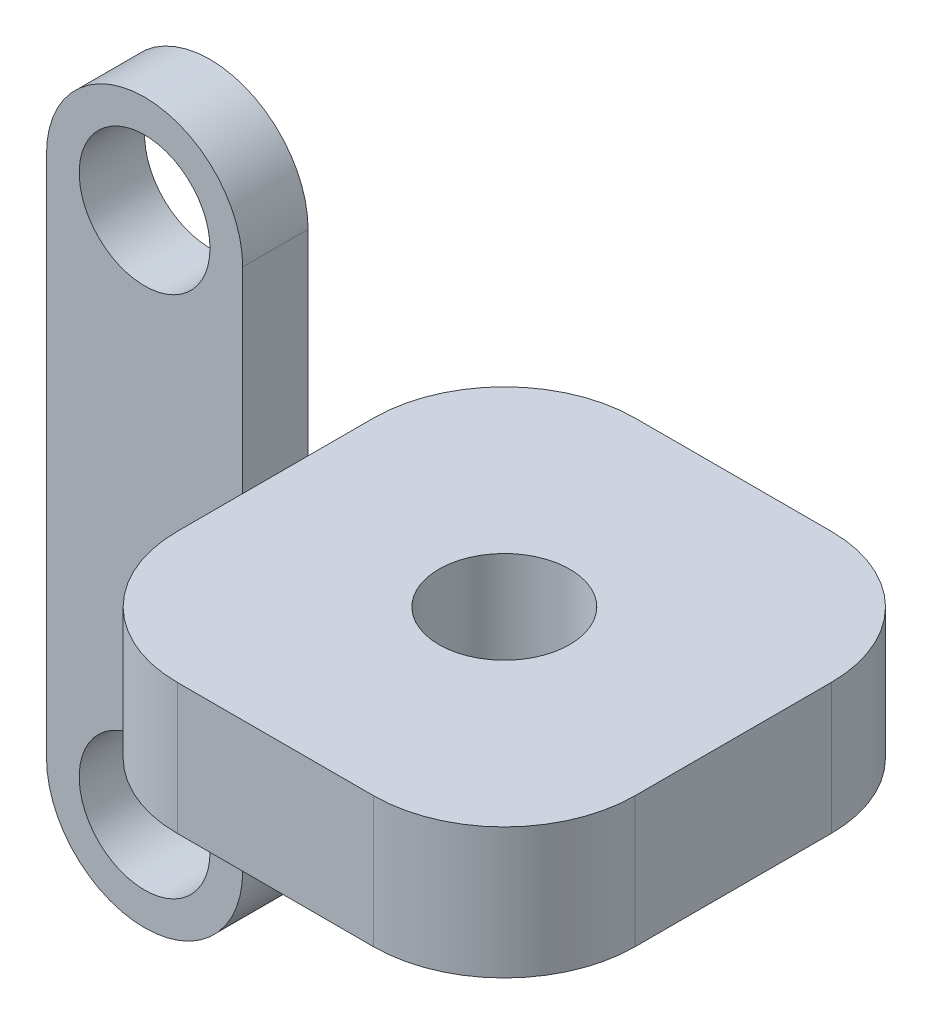
ISO-10303-21;
HEADER;
FILE_DESCRIPTION(('STEP AP214'),'2;1');
FILE_NAME('part.step','',(''),(''),'','','');
FILE_SCHEMA(('AUTOMOTIVE_DESIGN { 1 0 10303 214 1 1 1 1 }'));
ENDSEC;
DATA;
#1=APPLICATION_CONTEXT('core data for automotive mechanical design processes');
#2=APPLICATION_PROTOCOL_DEFINITION('international standard','automotive_design',2000,#1);
#3=PRODUCT_CONTEXT('',#1,'mechanical');
#4=PRODUCT('Part','Part','',(#3));
#5=PRODUCT_RELATED_PRODUCT_CATEGORY('part','',(#4));
#6=PRODUCT_DEFINITION_FORMATION('','',#4);
#7=PRODUCT_DEFINITION_CONTEXT('part definition',#1,'design');
#8=PRODUCT_DEFINITION('design','',#6,#7);
#9=PRODUCT_DEFINITION_SHAPE('','',#8);
#10=(LENGTH_UNIT() NAMED_UNIT(*) SI_UNIT(.MILLI.,.METRE.));
#11=(NAMED_UNIT(*) PLANE_ANGLE_UNIT() SI_UNIT($,.RADIAN.));
#12=(NAMED_UNIT(*) SI_UNIT($,.STERADIAN.) SOLID_ANGLE_UNIT());
#13=UNCERTAINTY_MEASURE_WITH_UNIT(LENGTH_MEASURE(1.E-05),#10,'distance_accuracy_value','');
#14=(GEOMETRIC_REPRESENTATION_CONTEXT(3) GLOBAL_UNCERTAINTY_ASSIGNED_CONTEXT((#13)) GLOBAL_UNIT_ASSIGNED_CONTEXT((#10,
#11,#12)) REPRESENTATION_CONTEXT('',''));
#15=CARTESIAN_POINT('',(0.,0.,0.));
#16=DIRECTION('',(0.,0.,1.));
#17=DIRECTION('',(1.,0.,0.));
#18=AXIS2_PLACEMENT_3D('',#15,#16,#17);
#19=CARTESIAN_POINT('',(0.,20.,5.));
#20=DIRECTION('',(-1.,0.,0.));
#21=DIRECTION('',(0.,-1.,0.));
#22=AXIS2_PLACEMENT_3D('',#19,#20,#21);
#23=PLANE('',#22);
#24=DIRECTION('',(0.,0.,1.));
#25=VECTOR('',#24,1.);
#26=CARTESIAN_POINT('',(0.,-5.,-15.));
#27=LINE('',#26,#25);
#28=CARTESIAN_POINT('',(0.,-5.,0.));
#29=VERTEX_POINT('',#28);
#30=CARTESIAN_POINT('',(0.,-5.,5.));
#31=VERTEX_POINT('',#30);
#32=EDGE_CURVE('E270',#29,#31,#27,.T.);
#33=ORIENTED_EDGE('',*,*,#32,.T.);
#34=DIRECTION('',(0.,1.,0.));
#35=VECTOR('',#34,1.);
#36=CARTESIAN_POINT('',(0.,20.,5.));
#37=LINE('',#36,#35);
#38=CARTESIAN_POINT('',(0.,-20.,5.));
#39=VERTEX_POINT('',#38);
#40=EDGE_CURVE('E193',#39,#31,#37,.T.);
#41=ORIENTED_EDGE('',*,*,#40,.F.);
#42=DIRECTION('',(0.,0.,-1.));
#43=VECTOR('',#42,1.);
#44=CARTESIAN_POINT('',(0.,-20.,5.));
#45=LINE('',#44,#43);
#46=CARTESIAN_POINT('',(0.,-20.,0.));
#47=VERTEX_POINT('',#46);
#48=EDGE_CURVE('E192',#39,#47,#45,.T.);
#49=ORIENTED_EDGE('',*,*,#48,.T.);
#50=DIRECTION('',(0.,1.,0.));
#51=VECTOR('',#50,1.);
#52=CARTESIAN_POINT('',(0.,20.,0.));
#53=LINE('',#52,#51);
#54=EDGE_CURVE('E175',#47,#29,#53,.T.);
#55=ORIENTED_EDGE('',*,*,#54,.T.);
#56=EDGE_LOOP('',(#33,#41,#49,#55));
#57=FACE_BOUND('',#56,.T.);
#58=ADVANCED_FACE('F39',(#57),#23,.F.);
#59=CARTESIAN_POINT('',(-7.49999999999999,20.,5.));
#60=DIRECTION('',(0.,0.,-1.));
#61=DIRECTION('',(-1.,0.,0.));
#62=AXIS2_PLACEMENT_3D('',#59,#60,#61);
#63=CYLINDRICAL_SURFACE('',#62,7.5);
#64=CARTESIAN_POINT('',(-7.49999999999999,20.,0.));
#65=DIRECTION('',(0.,0.,1.));
#66=DIRECTION('',(1.,0.,0.));
#67=AXIS2_PLACEMENT_3D('',#64,#65,#66);
#68=CIRCLE('',#67,7.5);
#69=CARTESIAN_POINT('',(0.,20.,0.));
#70=VERTEX_POINT('',#69);
#71=CARTESIAN_POINT('',(-15.,20.,0.));
#72=VERTEX_POINT('',#71);
#73=EDGE_CURVE('E168',#70,#72,#68,.T.);
#74=ORIENTED_EDGE('',*,*,#73,.T.);
#75=DIRECTION('',(0.,0.,-1.));
#76=VECTOR('',#75,1.);
#77=CARTESIAN_POINT('',(-15.,20.,5.));
#78=LINE('',#77,#76);
#79=CARTESIAN_POINT('',(-15.,20.,5.));
#80=VERTEX_POINT('',#79);
#81=EDGE_CURVE('E201',#80,#72,#78,.T.);
#82=ORIENTED_EDGE('',*,*,#81,.F.);
#83=CARTESIAN_POINT('',(-7.49999999999999,20.,5.));
#84=DIRECTION('',(0.,0.,1.));
#85=DIRECTION('',(1.,0.,0.));
#86=AXIS2_PLACEMENT_3D('',#83,#84,#85);
#87=CIRCLE('',#86,7.5);
#88=CARTESIAN_POINT('',(0.,20.,5.));
#89=VERTEX_POINT('',#88);
#90=EDGE_CURVE('E185',#89,#80,#87,.T.);
#91=ORIENTED_EDGE('',*,*,#90,.F.);
#92=DIRECTION('',(0.,0.,-1.));
#93=VECTOR('',#92,1.);
#94=CARTESIAN_POINT('',(0.,20.,5.));
#95=LINE('',#94,#93);
#96=EDGE_CURVE('E189',#89,#70,#95,.T.);
#97=ORIENTED_EDGE('',*,*,#96,.T.);
#98=EDGE_LOOP('',(#74,#82,#91,#97));
#99=FACE_BOUND('',#98,.T.);
#100=ADVANCED_FACE('F372',(#99),#63,.T.);
#101=CARTESIAN_POINT('',(-15.,20.,5.));
#102=DIRECTION('',(1.,0.,0.));
#103=DIRECTION('',(0.,1.,0.));
#104=AXIS2_PLACEMENT_3D('',#101,#102,#103);
#105=PLANE('',#104);
#106=DIRECTION('',(0.,-1.,0.));
#107=VECTOR('',#106,1.);
#108=CARTESIAN_POINT('',(-15.,20.,0.));
#109=LINE('',#108,#107);
#110=CARTESIAN_POINT('',(-15.,-20.,0.));
#111=VERTEX_POINT('',#110);
#112=EDGE_CURVE('E311',#72,#111,#109,.T.);
#113=ORIENTED_EDGE('',*,*,#112,.T.);
#114=DIRECTION('',(0.,0.,-1.));
#115=VECTOR('',#114,1.);
#116=CARTESIAN_POINT('',(-15.,-20.,5.));
#117=LINE('',#116,#115);
#118=CARTESIAN_POINT('',(-15.,-20.,5.));
#119=VERTEX_POINT('',#118);
#120=EDGE_CURVE('E197',#119,#111,#117,.T.);
#121=ORIENTED_EDGE('',*,*,#120,.F.);
#122=DIRECTION('',(0.,-1.,0.));
#123=VECTOR('',#122,1.);
#124=CARTESIAN_POINT('',(-15.,20.,5.));
#125=LINE('',#124,#123);
#126=EDGE_CURVE('E301',#80,#119,#125,.T.);
#127=ORIENTED_EDGE('',*,*,#126,.F.);
#128=ORIENTED_EDGE('',*,*,#81,.T.);
#129=EDGE_LOOP('',(#113,#121,#127,#128));
#130=FACE_BOUND('',#129,.T.);
#131=ADVANCED_FACE('F377',(#130),#105,.F.);
#132=CARTESIAN_POINT('',(-7.49999999999999,-20.,5.));
#133=DIRECTION('',(0.,0.,-1.));
#134=DIRECTION('',(-1.,0.,0.));
#135=AXIS2_PLACEMENT_3D('',#132,#133,#134);
#136=CYLINDRICAL_SURFACE('',#135,7.5);
#137=CARTESIAN_POINT('',(-7.49999999999999,-20.,0.));
#138=DIRECTION('',(0.,0.,1.));
#139=DIRECTION('',(1.,0.,0.));
#140=AXIS2_PLACEMENT_3D('',#137,#138,#139);
#141=CIRCLE('',#140,7.5);
#142=EDGE_CURVE('E173',#111,#47,#141,.T.);
#143=ORIENTED_EDGE('',*,*,#142,.T.);
#144=ORIENTED_EDGE('',*,*,#48,.F.);
#145=CARTESIAN_POINT('',(-7.49999999999999,-20.,5.));
#146=DIRECTION('',(0.,0.,1.));
#147=DIRECTION('',(1.,0.,0.));
#148=AXIS2_PLACEMENT_3D('',#145,#146,#147);
#149=CIRCLE('',#148,7.5);
#150=EDGE_CURVE('E304',#119,#39,#149,.T.);
#151=ORIENTED_EDGE('',*,*,#150,.F.);
#152=ORIENTED_EDGE('',*,*,#120,.T.);
#153=EDGE_LOOP('',(#143,#144,#151,#152));
#154=FACE_BOUND('',#153,.T.);
#155=ADVANCED_FACE('F319',(#154),#136,.T.);
#156=CARTESIAN_POINT('',(0.,5.,5.));
#157=VERTEX_POINT('',#156);
#158=EDGE_CURVE('E177',#157,#89,#37,.T.);
#159=ORIENTED_EDGE('',*,*,#158,.F.);
#160=DIRECTION('',(0.,0.,1.));
#161=VECTOR('',#160,1.);
#162=CARTESIAN_POINT('',(0.,5.,-15.));
#163=LINE('',#162,#161);
#164=CARTESIAN_POINT('',(0.,5.,0.));
#165=VERTEX_POINT('',#164);
#166=EDGE_CURVE('E148',#165,#157,#163,.T.);
#167=ORIENTED_EDGE('',*,*,#166,.F.);
#168=EDGE_CURVE('E162',#165,#70,#53,.T.);
#169=ORIENTED_EDGE('',*,*,#168,.T.);
#170=ORIENTED_EDGE('',*,*,#96,.F.);
#171=EDGE_LOOP('',(#159,#167,#169,#170));
#172=FACE_BOUND('',#171,.T.);
#173=ADVANCED_FACE('F176',(#172),#23,.F.);
#174=CARTESIAN_POINT('',(-7.49999999999999,20.,5.));
#175=DIRECTION('',(0.,0.,1.));
#176=DIRECTION('',(1.,0.,0.));
#177=AXIS2_PLACEMENT_3D('',#174,#175,#176);
#178=PLANE('',#177);
#179=CARTESIAN_POINT('',(-7.49999999999999,20.,5.));
#180=DIRECTION('',(0.,0.,1.));
#181=DIRECTION('',(1.,0.,0.));
#182=AXIS2_PLACEMENT_3D('',#179,#180,#181);
#183=CIRCLE('',#182,5.);
#184=CARTESIAN_POINT('',(-2.49999999999999,20.,5.));
#185=VERTEX_POINT('',#184);
#186=EDGE_CURVE('E287',#185,#185,#183,.T.);
#187=ORIENTED_EDGE('',*,*,#186,.F.);
#188=EDGE_LOOP('',(#187));
#189=FACE_BOUND('',#188,.T.);
#190=CARTESIAN_POINT('',(-7.49999999999999,-20.,5.));
#191=DIRECTION('',(0.,0.,1.));
#192=DIRECTION('',(1.,0.,0.));
#193=AXIS2_PLACEMENT_3D('',#190,#191,#192);
#194=CIRCLE('',#193,5.);
#195=CARTESIAN_POINT('',(-2.49999999999999,-20.,5.));
#196=VERTEX_POINT('',#195);
#197=EDGE_CURVE('E281',#196,#196,#194,.T.);
#198=ORIENTED_EDGE('',*,*,#197,.F.);
#199=EDGE_LOOP('',(#198));
#200=FACE_BOUND('',#199,.T.);
#201=ORIENTED_EDGE('',*,*,#90,.T.);
#202=ORIENTED_EDGE('',*,*,#126,.T.);
#203=ORIENTED_EDGE('',*,*,#150,.T.);
#204=ORIENTED_EDGE('',*,*,#40,.T.);
#205=DIRECTION('',(0.,1.,0.));
#206=VECTOR('',#205,1.);
#207=CARTESIAN_POINT('',(0.,20.,5.));
#208=LINE('',#207,#206);
#209=EDGE_CURVE('E278',#31,#157,#208,.T.);
#210=ORIENTED_EDGE('',*,*,#209,.T.);
#211=ORIENTED_EDGE('',*,*,#158,.T.);
#212=EDGE_LOOP('',(#201,#202,#203,#204,#210,#211));
#213=FACE_BOUND('',#212,.T.);
#214=ADVANCED_FACE('F326',(#189,#200,#213),#178,.T.);
#215=CARTESIAN_POINT('',(-7.49999999999999,20.,0.));
#216=DIRECTION('',(0.,0.,1.));
#217=DIRECTION('',(1.,0.,0.));
#218=AXIS2_PLACEMENT_3D('',#215,#216,#217);
#219=PLANE('',#218);
#220=CARTESIAN_POINT('',(-7.49999999999999,20.,0.));
#221=DIRECTION('',(0.,0.,1.));
#222=DIRECTION('',(1.,0.,0.));
#223=AXIS2_PLACEMENT_3D('',#220,#221,#222);
#224=CIRCLE('',#223,5.);
#225=CARTESIAN_POINT('',(-2.49999999999999,20.,0.));
#226=VERTEX_POINT('',#225);
#227=EDGE_CURVE('E283',#226,#226,#224,.T.);
#228=ORIENTED_EDGE('',*,*,#227,.T.);
#229=EDGE_LOOP('',(#228));
#230=FACE_BOUND('',#229,.T.);
#231=CARTESIAN_POINT('',(-7.49999999999999,-20.,0.));
#232=DIRECTION('',(0.,0.,1.));
#233=DIRECTION('',(1.,0.,0.));
#234=AXIS2_PLACEMENT_3D('',#231,#232,#233);
#235=CIRCLE('',#234,5.);
#236=CARTESIAN_POINT('',(-2.49999999999999,-20.,0.));
#237=VERTEX_POINT('',#236);
#238=EDGE_CURVE('E291',#237,#237,#235,.T.);
#239=ORIENTED_EDGE('',*,*,#238,.T.);
#240=EDGE_LOOP('',(#239));
#241=FACE_BOUND('',#240,.T.);
#242=ORIENTED_EDGE('',*,*,#73,.F.);
#243=ORIENTED_EDGE('',*,*,#168,.F.);
#244=EDGE_CURVE('E165',#29,#165,#53,.T.);
#245=ORIENTED_EDGE('',*,*,#244,.F.);
#246=ORIENTED_EDGE('',*,*,#54,.F.);
#247=ORIENTED_EDGE('',*,*,#142,.F.);
#248=ORIENTED_EDGE('',*,*,#112,.F.);
#249=EDGE_LOOP('',(#242,#243,#245,#246,#247,#248));
#250=FACE_BOUND('',#249,.T.);
#251=ADVANCED_FACE('F163',(#230,#241,#250),#219,.F.);
#252=CARTESIAN_POINT('',(-7.49999999999999,-20.,0.));
#253=DIRECTION('',(0.,0.,1.));
#254=DIRECTION('',(1.,0.,0.));
#255=AXIS2_PLACEMENT_3D('',#252,#253,#254);
#256=CYLINDRICAL_SURFACE('',#255,5.);
#257=ORIENTED_EDGE('',*,*,#238,.F.);
#258=EDGE_LOOP('',(#257));
#259=FACE_BOUND('',#258,.T.);
#260=ORIENTED_EDGE('',*,*,#197,.T.);
#261=EDGE_LOOP('',(#260));
#262=FACE_BOUND('',#261,.T.);
#263=ADVANCED_FACE('F417',(#259,#262),#256,.F.);
#264=CARTESIAN_POINT('',(-7.49999999999999,20.,0.));
#265=DIRECTION('',(0.,0.,1.));
#266=DIRECTION('',(1.,0.,0.));
#267=AXIS2_PLACEMENT_3D('',#264,#265,#266);
#268=CYLINDRICAL_SURFACE('',#267,5.);
#269=ORIENTED_EDGE('',*,*,#227,.F.);
#270=EDGE_LOOP('',(#269));
#271=FACE_BOUND('',#270,.T.);
#272=ORIENTED_EDGE('',*,*,#186,.T.);
#273=EDGE_LOOP('',(#272));
#274=FACE_BOUND('',#273,.T.);
#275=ADVANCED_FACE('F414',(#271,#274),#268,.F.);
#276=CARTESIAN_POINT('',(0.,5.,-15.));
#277=DIRECTION('',(1.,0.,0.));
#278=DIRECTION('',(0.,0.,-1.));
#279=AXIS2_PLACEMENT_3D('',#276,#277,#278);
#280=PLANE('',#279);
#281=CARTESIAN_POINT('',(0.,5.,-5.));
#282=VERTEX_POINT('',#281);
#283=EDGE_CURVE('E142',#282,#165,#163,.T.);
#284=ORIENTED_EDGE('',*,*,#283,.F.);
#285=DIRECTION('',(0.,-1.,0.));
#286=VECTOR('',#285,1.);
#287=CARTESIAN_POINT('',(0.,5.,-5.));
#288=LINE('',#287,#286);
#289=CARTESIAN_POINT('',(0.,-5.,-5.));
#290=VERTEX_POINT('',#289);
#291=EDGE_CURVE('E205',#282,#290,#288,.T.);
#292=ORIENTED_EDGE('',*,*,#291,.T.);
#293=EDGE_CURVE('E182',#290,#29,#27,.T.);
#294=ORIENTED_EDGE('',*,*,#293,.T.);
#295=ORIENTED_EDGE('',*,*,#244,.T.);
#296=EDGE_LOOP('',(#284,#292,#294,#295));
#297=FACE_BOUND('',#296,.T.);
#298=ADVANCED_FACE('F180',(#297),#280,.F.);
#299=CARTESIAN_POINT('',(0.,-5.,10.));
#300=VERTEX_POINT('',#299);
#301=EDGE_CURVE('E272',#31,#300,#27,.T.);
#302=ORIENTED_EDGE('',*,*,#301,.T.);
#303=DIRECTION('',(0.,-1.,0.));
#304=VECTOR('',#303,1.);
#305=CARTESIAN_POINT('',(0.,5.,10.));
#306=LINE('',#305,#304);
#307=CARTESIAN_POINT('',(0.,5.,10.));
#308=VERTEX_POINT('',#307);
#309=EDGE_CURVE('E11',#300,#308,#306,.F.);
#310=ORIENTED_EDGE('',*,*,#309,.T.);
#311=EDGE_CURVE('E158',#157,#308,#163,.T.);
#312=ORIENTED_EDGE('',*,*,#311,.F.);
#313=ORIENTED_EDGE('',*,*,#209,.F.);
#314=EDGE_LOOP('',(#302,#310,#312,#313));
#315=FACE_BOUND('',#314,.T.);
#316=ADVANCED_FACE('F329',(#315),#280,.F.);
#317=CARTESIAN_POINT('',(0.,5.,20.));
#318=DIRECTION('',(0.,0.,-1.));
#319=DIRECTION('',(-1.,0.,0.));
#320=AXIS2_PLACEMENT_3D('',#317,#318,#319);
#321=PLANE('',#320);
#322=DIRECTION('',(1.,0.,0.));
#323=VECTOR('',#322,1.);
#324=CARTESIAN_POINT('',(0.,5.,20.));
#325=LINE('',#324,#323);
#326=CARTESIAN_POINT('',(10.,5.,20.));
#327=VERTEX_POINT('',#326);
#328=CARTESIAN_POINT('',(25.,5.,20.));
#329=VERTEX_POINT('',#328);
#330=EDGE_CURVE('E156',#327,#329,#325,.T.);
#331=ORIENTED_EDGE('',*,*,#330,.F.);
#332=DIRECTION('',(0.,-1.,0.));
#333=VECTOR('',#332,1.);
#334=CARTESIAN_POINT('',(10.,5.,20.));
#335=LINE('',#334,#333);
#336=CARTESIAN_POINT('',(10.,-5.,20.));
#337=VERTEX_POINT('',#336);
#338=EDGE_CURVE('E49',#327,#337,#335,.T.);
#339=ORIENTED_EDGE('',*,*,#338,.T.);
#340=DIRECTION('',(1.,0.,0.));
#341=VECTOR('',#340,1.);
#342=CARTESIAN_POINT('',(0.,-5.,20.));
#343=LINE('',#342,#341);
#344=CARTESIAN_POINT('',(25.,-5.,20.));
#345=VERTEX_POINT('',#344);
#346=EDGE_CURVE('E254',#337,#345,#343,.T.);
#347=ORIENTED_EDGE('',*,*,#346,.T.);
#348=DIRECTION('',(0.,-1.,0.));
#349=VECTOR('',#348,1.);
#350=CARTESIAN_POINT('',(25.,5.,20.));
#351=LINE('',#350,#349);
#352=EDGE_CURVE('E243',#345,#329,#351,.F.);
#353=ORIENTED_EDGE('',*,*,#352,.T.);
#354=EDGE_LOOP('',(#331,#339,#347,#353));
#355=FACE_BOUND('',#354,.T.);
#356=ADVANCED_FACE('F253',(#355),#321,.F.);
#357=CARTESIAN_POINT('',(35.,5.,-15.));
#358=DIRECTION('',(-1.,0.,0.));
#359=DIRECTION('',(0.,0.,1.));
#360=AXIS2_PLACEMENT_3D('',#357,#358,#359);
#361=PLANE('',#360);
#362=DIRECTION('',(0.,0.,-1.));
#363=VECTOR('',#362,1.);
#364=CARTESIAN_POINT('',(35.,-5.,-15.));
#365=LINE('',#364,#363);
#366=CARTESIAN_POINT('',(35.,-5.,10.));
#367=VERTEX_POINT('',#366);
#368=CARTESIAN_POINT('',(35.,-5.,-5.));
#369=VERTEX_POINT('',#368);
#370=EDGE_CURVE('E264',#367,#369,#365,.T.);
#371=ORIENTED_EDGE('',*,*,#370,.T.);
#372=DIRECTION('',(0.,-1.,0.));
#373=VECTOR('',#372,1.);
#374=CARTESIAN_POINT('',(35.,5.,-5.));
#375=LINE('',#374,#373);
#376=CARTESIAN_POINT('',(35.,5.,-5.));
#377=VERTEX_POINT('',#376);
#378=EDGE_CURVE('E56',#369,#377,#375,.F.);
#379=ORIENTED_EDGE('',*,*,#378,.T.);
#380=DIRECTION('',(0.,0.,-1.));
#381=VECTOR('',#380,1.);
#382=CARTESIAN_POINT('',(35.,5.,-15.));
#383=LINE('',#382,#381);
#384=CARTESIAN_POINT('',(35.,5.,10.));
#385=VERTEX_POINT('',#384);
#386=EDGE_CURVE('E346',#385,#377,#383,.T.);
#387=ORIENTED_EDGE('',*,*,#386,.F.);
#388=DIRECTION('',(0.,-1.,0.));
#389=VECTOR('',#388,1.);
#390=CARTESIAN_POINT('',(35.,5.,10.));
#391=LINE('',#390,#389);
#392=EDGE_CURVE('E237',#385,#367,#391,.T.);
#393=ORIENTED_EDGE('',*,*,#392,.T.);
#394=EDGE_LOOP('',(#371,#379,#387,#393));
#395=FACE_BOUND('',#394,.T.);
#396=ADVANCED_FACE('F360',(#395),#361,.F.);
#397=CARTESIAN_POINT('',(0.,5.,-15.));
#398=DIRECTION('',(0.,0.,1.));
#399=DIRECTION('',(1.,0.,0.));
#400=AXIS2_PLACEMENT_3D('',#397,#398,#399);
#401=PLANE('',#400);
#402=DIRECTION('',(-1.,0.,0.));
#403=VECTOR('',#402,1.);
#404=CARTESIAN_POINT('',(0.,-5.,-15.));
#405=LINE('',#404,#403);
#406=CARTESIAN_POINT('',(25.,-5.,-15.));
#407=VERTEX_POINT('',#406);
#408=CARTESIAN_POINT('',(10.,-5.,-15.));
#409=VERTEX_POINT('',#408);
#410=EDGE_CURVE('E268',#407,#409,#405,.T.);
#411=ORIENTED_EDGE('',*,*,#410,.T.);
#412=DIRECTION('',(0.,-1.,0.));
#413=VECTOR('',#412,1.);
#414=CARTESIAN_POINT('',(10.,5.,-15.));
#415=LINE('',#414,#413);
#416=CARTESIAN_POINT('',(10.,5.,-15.));
#417=VERTEX_POINT('',#416);
#418=EDGE_CURVE('E224',#409,#417,#415,.F.);
#419=ORIENTED_EDGE('',*,*,#418,.T.);
#420=DIRECTION('',(-1.,0.,0.));
#421=VECTOR('',#420,1.);
#422=CARTESIAN_POINT('',(0.,5.,-15.));
#423=LINE('',#422,#421);
#424=CARTESIAN_POINT('',(25.,5.,-15.));
#425=VERTEX_POINT('',#424);
#426=EDGE_CURVE('E282',#425,#417,#423,.T.);
#427=ORIENTED_EDGE('',*,*,#426,.F.);
#428=DIRECTION('',(0.,-1.,0.));
#429=VECTOR('',#428,1.);
#430=CARTESIAN_POINT('',(25.,5.,-15.));
#431=LINE('',#430,#429);
#432=EDGE_CURVE('E220',#425,#407,#431,.T.);
#433=ORIENTED_EDGE('',*,*,#432,.T.);
#434=EDGE_LOOP('',(#411,#419,#427,#433));
#435=FACE_BOUND('',#434,.T.);
#436=ADVANCED_FACE('F357',(#435),#401,.F.);
#437=CARTESIAN_POINT('',(0.,5.,0.));
#438=DIRECTION('',(0.,1.,0.));
#439=DIRECTION('',(0.,0.,1.));
#440=AXIS2_PLACEMENT_3D('',#437,#438,#439);
#441=PLANE('',#440);
#442=CARTESIAN_POINT('',(17.5,5.,2.5));
#443=DIRECTION('',(0.,1.,0.));
#444=DIRECTION('',(0.,0.,1.));
#445=AXIS2_PLACEMENT_3D('',#442,#443,#444);
#446=CIRCLE('',#445,5.);
#447=CARTESIAN_POINT('',(17.5,5.,7.5));
#448=VERTEX_POINT('',#447);
#449=EDGE_CURVE('E335',#448,#448,#446,.T.);
#450=ORIENTED_EDGE('',*,*,#449,.F.);
#451=EDGE_LOOP('',(#450));
#452=FACE_BOUND('',#451,.T.);
#453=ORIENTED_EDGE('',*,*,#426,.T.);
#454=CARTESIAN_POINT('',(10.,5.,-5.));
#455=DIRECTION('',(0.,1.,0.));
#456=DIRECTION('',(0.,0.,1.));
#457=AXIS2_PLACEMENT_3D('',#454,#455,#456);
#458=CIRCLE('',#457,10.);
#459=EDGE_CURVE('E150',#417,#282,#458,.T.);
#460=ORIENTED_EDGE('',*,*,#459,.T.);
#461=ORIENTED_EDGE('',*,*,#283,.T.);
#462=ORIENTED_EDGE('',*,*,#166,.T.);
#463=ORIENTED_EDGE('',*,*,#311,.T.);
#464=CARTESIAN_POINT('',(10.,5.,10.));
#465=DIRECTION('',(0.,1.,0.));
#466=DIRECTION('',(0.,0.,1.));
#467=AXIS2_PLACEMENT_3D('',#464,#465,#466);
#468=CIRCLE('',#467,10.);
#469=EDGE_CURVE('E229',#308,#327,#468,.T.);
#470=ORIENTED_EDGE('',*,*,#469,.T.);
#471=ORIENTED_EDGE('',*,*,#330,.T.);
#472=CARTESIAN_POINT('',(25.,5.,10.));
#473=DIRECTION('',(0.,1.,0.));
#474=DIRECTION('',(0.,0.,1.));
#475=AXIS2_PLACEMENT_3D('',#472,#473,#474);
#476=CIRCLE('',#475,10.);
#477=EDGE_CURVE('E63',#329,#385,#476,.T.);
#478=ORIENTED_EDGE('',*,*,#477,.T.);
#479=ORIENTED_EDGE('',*,*,#386,.T.);
#480=CARTESIAN_POINT('',(25.,5.,-5.));
#481=DIRECTION('',(0.,1.,0.));
#482=DIRECTION('',(0.,0.,1.));
#483=AXIS2_PLACEMENT_3D('',#480,#481,#482);
#484=CIRCLE('',#483,10.);
#485=EDGE_CURVE('E232',#377,#425,#484,.T.);
#486=ORIENTED_EDGE('',*,*,#485,.T.);
#487=EDGE_LOOP('',(#453,#460,#461,#462,#463,#470,#471,#478,#479,#486));
#488=FACE_BOUND('',#487,.T.);
#489=ADVANCED_FACE('F145',(#452,#488),#441,.T.);
#490=CARTESIAN_POINT('',(0.,-5.,0.));
#491=DIRECTION('',(0.,1.,0.));
#492=DIRECTION('',(0.,0.,1.));
#493=AXIS2_PLACEMENT_3D('',#490,#491,#492);
#494=PLANE('',#493);
#495=CARTESIAN_POINT('',(17.5,-5.,2.5));
#496=DIRECTION('',(0.,1.,0.));
#497=DIRECTION('',(0.,0.,1.));
#498=AXIS2_PLACEMENT_3D('',#495,#496,#497);
#499=CIRCLE('',#498,5.);
#500=CARTESIAN_POINT('',(17.5,-5.,7.5));
#501=VERTEX_POINT('',#500);
#502=EDGE_CURVE('E43',#501,#501,#499,.T.);
#503=ORIENTED_EDGE('',*,*,#502,.T.);
#504=EDGE_LOOP('',(#503));
#505=FACE_BOUND('',#504,.T.);
#506=ORIENTED_EDGE('',*,*,#293,.F.);
#507=CARTESIAN_POINT('',(10.,-5.,-5.));
#508=DIRECTION('',(0.,1.,0.));
#509=DIRECTION('',(0.,0.,1.));
#510=AXIS2_PLACEMENT_3D('',#507,#508,#509);
#511=CIRCLE('',#510,10.);
#512=EDGE_CURVE('E217',#290,#409,#511,.F.);
#513=ORIENTED_EDGE('',*,*,#512,.T.);
#514=ORIENTED_EDGE('',*,*,#410,.F.);
#515=CARTESIAN_POINT('',(25.,-5.,-5.));
#516=DIRECTION('',(0.,1.,0.));
#517=DIRECTION('',(0.,0.,1.));
#518=AXIS2_PLACEMENT_3D('',#515,#516,#517);
#519=CIRCLE('',#518,10.);
#520=EDGE_CURVE('E214',#407,#369,#519,.F.);
#521=ORIENTED_EDGE('',*,*,#520,.T.);
#522=ORIENTED_EDGE('',*,*,#370,.F.);
#523=CARTESIAN_POINT('',(25.,-5.,10.));
#524=DIRECTION('',(0.,1.,0.));
#525=DIRECTION('',(0.,0.,1.));
#526=AXIS2_PLACEMENT_3D('',#523,#524,#525);
#527=CIRCLE('',#526,10.);
#528=EDGE_CURVE('E208',#367,#345,#527,.F.);
#529=ORIENTED_EDGE('',*,*,#528,.T.);
#530=ORIENTED_EDGE('',*,*,#346,.F.);
#531=CARTESIAN_POINT('',(10.,-5.,10.));
#532=DIRECTION('',(0.,1.,0.));
#533=DIRECTION('',(0.,0.,1.));
#534=AXIS2_PLACEMENT_3D('',#531,#532,#533);
#535=CIRCLE('',#534,10.);
#536=EDGE_CURVE('E211',#337,#300,#535,.F.);
#537=ORIENTED_EDGE('',*,*,#536,.T.);
#538=ORIENTED_EDGE('',*,*,#301,.F.);
#539=ORIENTED_EDGE('',*,*,#32,.F.);
#540=EDGE_LOOP('',(#506,#513,#514,#521,#522,#529,#530,#537,#538,#539));
#541=FACE_BOUND('',#540,.T.);
#542=ADVANCED_FACE('F259',(#505,#541),#494,.F.);
#543=CARTESIAN_POINT('',(10.,5.,-5.));
#544=DIRECTION('',(0.,-1.,0.));
#545=DIRECTION('',(0.,0.,-1.));
#546=AXIS2_PLACEMENT_3D('',#543,#544,#545);
#547=CYLINDRICAL_SURFACE('',#546,10.);
#548=ORIENTED_EDGE('',*,*,#459,.F.);
#549=ORIENTED_EDGE('',*,*,#418,.F.);
#550=ORIENTED_EDGE('',*,*,#512,.F.);
#551=ORIENTED_EDGE('',*,*,#291,.F.);
#552=EDGE_LOOP('',(#548,#549,#550,#551));
#553=FACE_BOUND('',#552,.T.);
#554=ADVANCED_FACE('F355',(#553),#547,.T.);
#555=CARTESIAN_POINT('',(25.,5.,-5.));
#556=DIRECTION('',(0.,-1.,0.));
#557=DIRECTION('',(0.,0.,-1.));
#558=AXIS2_PLACEMENT_3D('',#555,#556,#557);
#559=CYLINDRICAL_SURFACE('',#558,10.);
#560=ORIENTED_EDGE('',*,*,#485,.F.);
#561=ORIENTED_EDGE('',*,*,#378,.F.);
#562=ORIENTED_EDGE('',*,*,#520,.F.);
#563=ORIENTED_EDGE('',*,*,#432,.F.);
#564=EDGE_LOOP('',(#560,#561,#562,#563));
#565=FACE_BOUND('',#564,.T.);
#566=ADVANCED_FACE('F359',(#565),#559,.T.);
#567=CARTESIAN_POINT('',(10.,5.,10.));
#568=DIRECTION('',(0.,-1.,0.));
#569=DIRECTION('',(0.,0.,-1.));
#570=AXIS2_PLACEMENT_3D('',#567,#568,#569);
#571=CYLINDRICAL_SURFACE('',#570,10.);
#572=ORIENTED_EDGE('',*,*,#469,.F.);
#573=ORIENTED_EDGE('',*,*,#309,.F.);
#574=ORIENTED_EDGE('',*,*,#536,.F.);
#575=ORIENTED_EDGE('',*,*,#338,.F.);
#576=EDGE_LOOP('',(#572,#573,#574,#575));
#577=FACE_BOUND('',#576,.T.);
#578=ADVANCED_FACE('F363',(#577),#571,.T.);
#579=CARTESIAN_POINT('',(25.,5.,10.));
#580=DIRECTION('',(0.,-1.,0.));
#581=DIRECTION('',(0.,0.,-1.));
#582=AXIS2_PLACEMENT_3D('',#579,#580,#581);
#583=CYLINDRICAL_SURFACE('',#582,10.);
#584=ORIENTED_EDGE('',*,*,#477,.F.);
#585=ORIENTED_EDGE('',*,*,#352,.F.);
#586=ORIENTED_EDGE('',*,*,#528,.F.);
#587=ORIENTED_EDGE('',*,*,#392,.F.);
#588=EDGE_LOOP('',(#584,#585,#586,#587));
#589=FACE_BOUND('',#588,.T.);
#590=ADVANCED_FACE('F41',(#589),#583,.T.);
#591=CARTESIAN_POINT('',(17.5,-27.5,2.5));
#592=DIRECTION('',(0.,1.,0.));
#593=DIRECTION('',(0.,0.,1.));
#594=AXIS2_PLACEMENT_3D('',#591,#592,#593);
#595=CYLINDRICAL_SURFACE('',#594,5.);
#596=ORIENTED_EDGE('',*,*,#449,.T.);
#597=EDGE_LOOP('',(#596));
#598=FACE_BOUND('',#597,.T.);
#599=ORIENTED_EDGE('',*,*,#502,.F.);
#600=EDGE_LOOP('',(#599));
#601=FACE_BOUND('',#600,.T.);
#602=ADVANCED_FACE('F369',(#598,#601),#595,.F.);
#603=CLOSED_SHELL('',(#58,#100,#131,#155,#173,#214,#251,#263,#275,#298,#316,#356,#396,#436,#489,
#542,#554,#566,#578,#590,#602));
#604=MANIFOLD_SOLID_BREP('B2',#603);
#605=ADVANCED_BREP_SHAPE_REPRESENTATION('',(#18,#604),#14);
#606=SHAPE_DEFINITION_REPRESENTATION(#9,#605);
ENDSEC;
END-ISO-10303-21;
